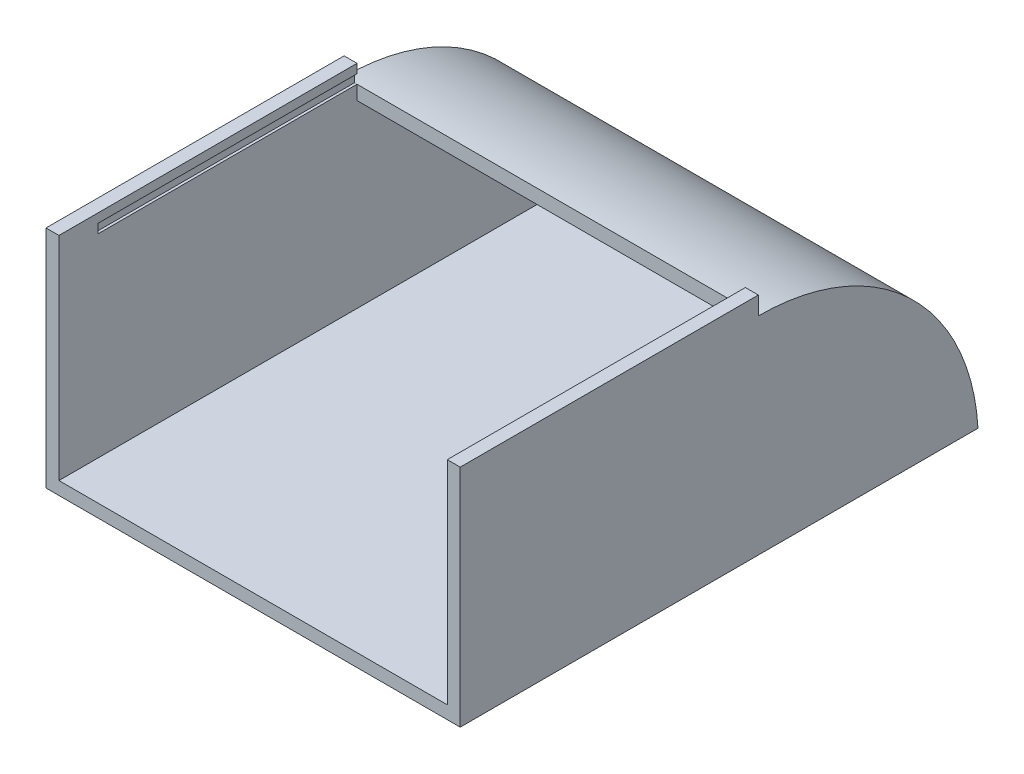
ISO-10303-21;
HEADER;
FILE_DESCRIPTION(('STEP AP214'),'2;1');
FILE_NAME('part.step','',(''),(''),'','','');
FILE_SCHEMA(('AUTOMOTIVE_DESIGN { 1 0 10303 214 1 1 1 1 }'));
ENDSEC;
DATA;
#1=APPLICATION_CONTEXT('core data for automotive mechanical design processes');
#2=APPLICATION_PROTOCOL_DEFINITION('international standard','automotive_design',2000,#1);
#3=PRODUCT_CONTEXT('',#1,'mechanical');
#4=PRODUCT('Part','Part','',(#3));
#5=PRODUCT_RELATED_PRODUCT_CATEGORY('part','',(#4));
#6=PRODUCT_DEFINITION_FORMATION('','',#4);
#7=PRODUCT_DEFINITION_CONTEXT('part definition',#1,'design');
#8=PRODUCT_DEFINITION('design','',#6,#7);
#9=PRODUCT_DEFINITION_SHAPE('','',#8);
#10=(LENGTH_UNIT() NAMED_UNIT(*) SI_UNIT(.MILLI.,.METRE.));
#11=(NAMED_UNIT(*) PLANE_ANGLE_UNIT() SI_UNIT($,.RADIAN.));
#12=(NAMED_UNIT(*) SI_UNIT($,.STERADIAN.) SOLID_ANGLE_UNIT());
#13=UNCERTAINTY_MEASURE_WITH_UNIT(LENGTH_MEASURE(1.E-05),#10,'distance_accuracy_value','');
#14=(GEOMETRIC_REPRESENTATION_CONTEXT(3) GLOBAL_UNCERTAINTY_ASSIGNED_CONTEXT((#13)) GLOBAL_UNIT_ASSIGNED_CONTEXT((#10,
#11,#12)) REPRESENTATION_CONTEXT('',''));
#15=CARTESIAN_POINT('',(0.,0.,0.));
#16=DIRECTION('',(0.,0.,1.));
#17=DIRECTION('',(1.,0.,0.));
#18=AXIS2_PLACEMENT_3D('',#15,#16,#17);
#19=CARTESIAN_POINT('',(80.,-40.,100.));
#20=DIRECTION('',(0.,0.,-1.));
#21=DIRECTION('',(-1.,0.,0.));
#22=AXIS2_PLACEMENT_3D('',#19,#20,#21);
#23=PLANE('',#22);
#24=DIRECTION('',(0.,-1.,0.));
#25=VECTOR('',#24,1.);
#26=CARTESIAN_POINT('',(80.,-40.,100.));
#27=LINE('',#26,#25);
#28=CARTESIAN_POINT('',(80.,47.,100.));
#29=VERTEX_POINT('',#28);
#30=CARTESIAN_POINT('',(80.,-40.,100.));
#31=VERTEX_POINT('',#30);
#32=EDGE_CURVE('E221',#29,#31,#27,.T.);
#33=ORIENTED_EDGE('',*,*,#32,.F.);
#34=DIRECTION('',(1.,0.,0.));
#35=VECTOR('',#34,1.);
#36=CARTESIAN_POINT('',(75.,47.,100.));
#37=LINE('',#36,#35);
#38=CARTESIAN_POINT('',(75.,47.,100.));
#39=VERTEX_POINT('',#38);
#40=EDGE_CURVE('E276',#39,#29,#37,.T.);
#41=ORIENTED_EDGE('',*,*,#40,.F.);
#42=DIRECTION('',(0.,1.,0.));
#43=VECTOR('',#42,1.);
#44=CARTESIAN_POINT('',(75.,-35.,100.));
#45=LINE('',#44,#43);
#46=CARTESIAN_POINT('',(75.,-35.,100.));
#47=VERTEX_POINT('',#46);
#48=EDGE_CURVE('E234',#47,#39,#45,.T.);
#49=ORIENTED_EDGE('',*,*,#48,.F.);
#50=DIRECTION('',(1.,0.,0.));
#51=VECTOR('',#50,1.);
#52=CARTESIAN_POINT('',(75.,-35.,100.));
#53=LINE('',#52,#51);
#54=CARTESIAN_POINT('',(-75.,-35.,100.));
#55=VERTEX_POINT('',#54);
#56=EDGE_CURVE('E236',#55,#47,#53,.T.);
#57=ORIENTED_EDGE('',*,*,#56,.F.);
#58=DIRECTION('',(0.,-1.,0.));
#59=VECTOR('',#58,1.);
#60=CARTESIAN_POINT('',(-75.,-35.,100.));
#61=LINE('',#60,#59);
#62=CARTESIAN_POINT('',(-75.,47.,100.));
#63=VERTEX_POINT('',#62);
#64=EDGE_CURVE('E239',#63,#55,#61,.T.);
#65=ORIENTED_EDGE('',*,*,#64,.F.);
#66=DIRECTION('',(1.,0.,0.));
#67=VECTOR('',#66,1.);
#68=CARTESIAN_POINT('',(-80.,47.,100.));
#69=LINE('',#68,#67);
#70=CARTESIAN_POINT('',(-80.,47.,100.));
#71=VERTEX_POINT('',#70);
#72=EDGE_CURVE('E262',#71,#63,#69,.T.);
#73=ORIENTED_EDGE('',*,*,#72,.F.);
#74=DIRECTION('',(0.,-1.,0.));
#75=VECTOR('',#74,1.);
#76=CARTESIAN_POINT('',(-80.,-40.,100.));
#77=LINE('',#76,#75);
#78=CARTESIAN_POINT('',(-80.,-40.,100.));
#79=VERTEX_POINT('',#78);
#80=EDGE_CURVE('E222',#71,#79,#77,.T.);
#81=ORIENTED_EDGE('',*,*,#80,.T.);
#82=DIRECTION('',(-1.,0.,0.));
#83=VECTOR('',#82,1.);
#84=CARTESIAN_POINT('',(80.,-40.,100.));
#85=LINE('',#84,#83);
#86=EDGE_CURVE('E209',#31,#79,#85,.T.);
#87=ORIENTED_EDGE('',*,*,#86,.F.);
#88=EDGE_LOOP('',(#33,#41,#49,#57,#65,#73,#81,#87));
#89=FACE_BOUND('',#88,.T.);
#90=ADVANCED_FACE('F33',(#89),#23,.F.);
#91=CARTESIAN_POINT('',(80.,-40.,-100.));
#92=DIRECTION('',(0.,1.,0.));
#93=DIRECTION('',(0.,0.,1.));
#94=AXIS2_PLACEMENT_3D('',#91,#92,#93);
#95=PLANE('',#94);
#96=DIRECTION('',(0.,0.,-1.));
#97=VECTOR('',#96,1.);
#98=CARTESIAN_POINT('',(-80.,-40.,-100.));
#99=LINE('',#98,#97);
#100=CARTESIAN_POINT('',(-80.,-40.,-100.));
#101=VERTEX_POINT('',#100);
#102=EDGE_CURVE('E218',#79,#101,#99,.T.);
#103=ORIENTED_EDGE('',*,*,#102,.T.);
#104=DIRECTION('',(-1.,0.,0.));
#105=VECTOR('',#104,1.);
#106=CARTESIAN_POINT('',(80.,-40.,-100.));
#107=LINE('',#106,#105);
#108=CARTESIAN_POINT('',(80.,-40.,-100.));
#109=VERTEX_POINT('',#108);
#110=EDGE_CURVE('E214',#109,#101,#107,.T.);
#111=ORIENTED_EDGE('',*,*,#110,.F.);
#112=DIRECTION('',(0.,0.,-1.));
#113=VECTOR('',#112,1.);
#114=CARTESIAN_POINT('',(80.,-40.,-100.));
#115=LINE('',#114,#113);
#116=EDGE_CURVE('E217',#31,#109,#115,.T.);
#117=ORIENTED_EDGE('',*,*,#116,.F.);
#118=ORIENTED_EDGE('',*,*,#86,.T.);
#119=EDGE_LOOP('',(#103,#111,#117,#118));
#120=FACE_BOUND('',#119,.T.);
#121=ADVANCED_FACE('F333',(#120),#95,.F.);
#122=CARTESIAN_POINT('',(80.,0.,0.));
#123=DIRECTION('',(1.,0.,0.));
#124=DIRECTION('',(0.,0.,-1.));
#125=AXIS2_PLACEMENT_3D('',#122,#123,#124);
#126=PLANE('',#125);
#127=ORIENTED_EDGE('',*,*,#116,.T.);
#128=CARTESIAN_POINT('',(80.,-45.,-15.1471862576143));
#129=DIRECTION('',(1.,0.,0.));
#130=DIRECTION('',(0.,0.,-1.));
#131=AXIS2_PLACEMENT_3D('',#128,#129,#130);
#132=CIRCLE('',#131,85.);
#133=CARTESIAN_POINT('',(80.,40.,-15.1471862576143));
#134=VERTEX_POINT('',#133);
#135=EDGE_CURVE('E11',#109,#134,#132,.T.);
#136=ORIENTED_EDGE('',*,*,#135,.T.);
#137=DIRECTION('',(0.,-1.,0.));
#138=VECTOR('',#137,1.);
#139=CARTESIAN_POINT('',(80.,47.,-15.1471862576143));
#140=LINE('',#139,#138);
#141=CARTESIAN_POINT('',(80.,47.,-15.1471862576143));
#142=VERTEX_POINT('',#141);
#143=EDGE_CURVE('E192',#142,#134,#140,.T.);
#144=ORIENTED_EDGE('',*,*,#143,.F.);
#145=DIRECTION('',(0.,0.,-1.));
#146=VECTOR('',#145,1.);
#147=CARTESIAN_POINT('',(80.,47.,-15.1471862576143));
#148=LINE('',#147,#146);
#149=EDGE_CURVE('E274',#29,#142,#148,.T.);
#150=ORIENTED_EDGE('',*,*,#149,.F.);
#151=ORIENTED_EDGE('',*,*,#32,.T.);
#152=EDGE_LOOP('',(#127,#136,#144,#150,#151));
#153=FACE_BOUND('',#152,.T.);
#154=ADVANCED_FACE('F330',(#153),#126,.T.);
#155=CARTESIAN_POINT('',(-80.,0.,0.));
#156=DIRECTION('',(1.,0.,0.));
#157=DIRECTION('',(0.,0.,-1.));
#158=AXIS2_PLACEMENT_3D('',#155,#156,#157);
#159=PLANE('',#158);
#160=ORIENTED_EDGE('',*,*,#80,.F.);
#161=DIRECTION('',(0.,0.,1.));
#162=VECTOR('',#161,1.);
#163=CARTESIAN_POINT('',(-80.,47.,-15.1471862576143));
#164=LINE('',#163,#162);
#165=CARTESIAN_POINT('',(-80.,47.,-15.1471862576143));
#166=VERTEX_POINT('',#165);
#167=EDGE_CURVE('E265',#166,#71,#164,.T.);
#168=ORIENTED_EDGE('',*,*,#167,.F.);
#169=DIRECTION('',(0.,-1.,0.));
#170=VECTOR('',#169,1.);
#171=CARTESIAN_POINT('',(-80.,47.,-15.1471862576143));
#172=LINE('',#171,#170);
#173=CARTESIAN_POINT('',(-80.,40.,-15.1471862576143));
#174=VERTEX_POINT('',#173);
#175=EDGE_CURVE('E255',#166,#174,#172,.T.);
#176=ORIENTED_EDGE('',*,*,#175,.T.);
#177=CARTESIAN_POINT('',(-80.,-45.,-15.1471862576143));
#178=DIRECTION('',(1.,0.,0.));
#179=DIRECTION('',(0.,0.,-1.));
#180=AXIS2_PLACEMENT_3D('',#177,#178,#179);
#181=CIRCLE('',#180,85.);
#182=EDGE_CURVE('E41',#174,#101,#181,.F.);
#183=ORIENTED_EDGE('',*,*,#182,.T.);
#184=ORIENTED_EDGE('',*,*,#102,.F.);
#185=EDGE_LOOP('',(#160,#168,#176,#183,#184));
#186=FACE_BOUND('',#185,.T.);
#187=ADVANCED_FACE('F336',(#186),#159,.F.);
#188=CARTESIAN_POINT('',(-75.,-35.,-90.));
#189=DIRECTION('',(-1.,0.,0.));
#190=DIRECTION('',(0.,0.,1.));
#191=AXIS2_PLACEMENT_3D('',#188,#189,#190);
#192=PLANE('',#191);
#193=DIRECTION('',(0.,1.,0.));
#194=VECTOR('',#193,1.);
#195=CARTESIAN_POINT('',(-75.,30.,-15.1471862576143));
#196=LINE('',#195,#194);
#197=CARTESIAN_POINT('',(-75.,34.5418695157532,-15.1471862576143));
#198=VERTEX_POINT('',#197);
#199=CARTESIAN_POINT('',(-75.,40.,-15.1471862576143));
#200=VERTEX_POINT('',#199);
#201=EDGE_CURVE('E247',#198,#200,#196,.T.);
#202=ORIENTED_EDGE('',*,*,#201,.T.);
#203=DIRECTION('',(0.,0.,-1.));
#204=VECTOR('',#203,1.);
#205=CARTESIAN_POINT('',(-75.,40.,-15.1471862576143));
#206=LINE('',#205,#204);
#207=CARTESIAN_POINT('',(-75.,40.,84.8528137423857));
#208=VERTEX_POINT('',#207);
#209=EDGE_CURVE('E288',#208,#200,#206,.T.);
#210=ORIENTED_EDGE('',*,*,#209,.F.);
#211=DIRECTION('',(0.,-1.,0.));
#212=VECTOR('',#211,1.);
#213=CARTESIAN_POINT('',(-75.,40.,84.8528137423857));
#214=LINE('',#213,#212);
#215=CARTESIAN_POINT('',(-75.,43.5,84.8528137423857));
#216=VERTEX_POINT('',#215);
#217=EDGE_CURVE('E291',#216,#208,#214,.T.);
#218=ORIENTED_EDGE('',*,*,#217,.F.);
#219=DIRECTION('',(0.,0.,1.));
#220=VECTOR('',#219,1.);
#221=CARTESIAN_POINT('',(-75.,43.5,-15.1471862576143));
#222=LINE('',#221,#220);
#223=CARTESIAN_POINT('',(-75.,43.5,-15.1471862576143));
#224=VERTEX_POINT('',#223);
#225=EDGE_CURVE('E294',#224,#216,#222,.T.);
#226=ORIENTED_EDGE('',*,*,#225,.F.);
#227=DIRECTION('',(0.,-1.,0.));
#228=VECTOR('',#227,1.);
#229=CARTESIAN_POINT('',(-75.,47.,-15.1471862576143));
#230=LINE('',#229,#228);
#231=CARTESIAN_POINT('',(-75.,47.,-15.1471862576143));
#232=VERTEX_POINT('',#231);
#233=EDGE_CURVE('E252',#232,#224,#230,.T.);
#234=ORIENTED_EDGE('',*,*,#233,.F.);
#235=DIRECTION('',(0.,0.,-1.));
#236=VECTOR('',#235,1.);
#237=CARTESIAN_POINT('',(-75.,47.,-15.1471862576143));
#238=LINE('',#237,#236);
#239=EDGE_CURVE('E260',#63,#232,#238,.T.);
#240=ORIENTED_EDGE('',*,*,#239,.F.);
#241=ORIENTED_EDGE('',*,*,#64,.T.);
#242=DIRECTION('',(0.,0.,1.));
#243=VECTOR('',#242,1.);
#244=CARTESIAN_POINT('',(-75.,-35.,-90.));
#245=LINE('',#244,#243);
#246=CARTESIAN_POINT('',(-75.,-35.,-90.));
#247=VERTEX_POINT('',#246);
#248=EDGE_CURVE('E229',#247,#55,#245,.T.);
#249=ORIENTED_EDGE('',*,*,#248,.F.);
#250=CARTESIAN_POINT('',(-75.,-50.,-6.33399734659242));
#251=DIRECTION('',(-1.,0.,0.));
#252=DIRECTION('',(0.,0.,1.));
#253=AXIS2_PLACEMENT_3D('',#250,#251,#252);
#254=CIRCLE('',#253,85.);
#255=EDGE_CURVE('E203',#247,#198,#254,.F.);
#256=ORIENTED_EDGE('',*,*,#255,.T.);
#257=EDGE_LOOP('',(#202,#210,#218,#226,#234,#240,#241,#249,#256));
#258=FACE_BOUND('',#257,.T.);
#259=ADVANCED_FACE('F348',(#258),#192,.F.);
#260=CARTESIAN_POINT('',(75.,-35.,-90.));
#261=DIRECTION('',(1.,0.,0.));
#262=DIRECTION('',(0.,0.,-1.));
#263=AXIS2_PLACEMENT_3D('',#260,#261,#262);
#264=PLANE('',#263);
#265=DIRECTION('',(0.,-1.,0.));
#266=VECTOR('',#265,1.);
#267=CARTESIAN_POINT('',(75.,47.,-15.1471862576143));
#268=LINE('',#267,#266);
#269=CARTESIAN_POINT('',(75.,47.,-15.1471862576143));
#270=VERTEX_POINT('',#269);
#271=CARTESIAN_POINT('',(75.,43.5,-15.1471862576143));
#272=VERTEX_POINT('',#271);
#273=EDGE_CURVE('E269',#270,#272,#268,.T.);
#274=ORIENTED_EDGE('',*,*,#273,.T.);
#275=DIRECTION('',(0.,0.,-1.));
#276=VECTOR('',#275,1.);
#277=CARTESIAN_POINT('',(75.,43.5,-15.1471862576143));
#278=LINE('',#277,#276);
#279=CARTESIAN_POINT('',(75.,43.5,84.8528137423857));
#280=VERTEX_POINT('',#279);
#281=EDGE_CURVE('E176',#280,#272,#278,.T.);
#282=ORIENTED_EDGE('',*,*,#281,.F.);
#283=DIRECTION('',(0.,1.,0.));
#284=VECTOR('',#283,1.);
#285=CARTESIAN_POINT('',(75.,40.,84.8528137423857));
#286=LINE('',#285,#284);
#287=CARTESIAN_POINT('',(75.,40.,84.8528137423857));
#288=VERTEX_POINT('',#287);
#289=EDGE_CURVE('E310',#288,#280,#286,.T.);
#290=ORIENTED_EDGE('',*,*,#289,.F.);
#291=DIRECTION('',(0.,0.,1.));
#292=VECTOR('',#291,1.);
#293=CARTESIAN_POINT('',(75.,40.,-15.1471862576143));
#294=LINE('',#293,#292);
#295=CARTESIAN_POINT('',(75.,40.,-15.1471862576143));
#296=VERTEX_POINT('',#295);
#297=EDGE_CURVE('E313',#296,#288,#294,.T.);
#298=ORIENTED_EDGE('',*,*,#297,.F.);
#299=DIRECTION('',(0.,1.,0.));
#300=VECTOR('',#299,1.);
#301=CARTESIAN_POINT('',(75.,30.,-15.1471862576143));
#302=LINE('',#301,#300);
#303=CARTESIAN_POINT('',(75.,34.5418695157532,-15.1471862576143));
#304=VERTEX_POINT('',#303);
#305=EDGE_CURVE('E246',#304,#296,#302,.T.);
#306=ORIENTED_EDGE('',*,*,#305,.F.);
#307=CARTESIAN_POINT('',(75.,-50.,-6.33399734659242));
#308=DIRECTION('',(1.,0.,0.));
#309=DIRECTION('',(0.,0.,-1.));
#310=AXIS2_PLACEMENT_3D('',#307,#308,#309);
#311=CIRCLE('',#310,85.);
#312=CARTESIAN_POINT('',(75.,-35.,-90.));
#313=VERTEX_POINT('',#312);
#314=EDGE_CURVE('E197',#304,#313,#311,.F.);
#315=ORIENTED_EDGE('',*,*,#314,.T.);
#316=DIRECTION('',(0.,0.,1.));
#317=VECTOR('',#316,1.);
#318=CARTESIAN_POINT('',(75.,-35.,-90.));
#319=LINE('',#318,#317);
#320=EDGE_CURVE('E225',#313,#47,#319,.T.);
#321=ORIENTED_EDGE('',*,*,#320,.T.);
#322=ORIENTED_EDGE('',*,*,#48,.T.);
#323=DIRECTION('',(0.,0.,1.));
#324=VECTOR('',#323,1.);
#325=CARTESIAN_POINT('',(75.,47.,-15.1471862576143));
#326=LINE('',#325,#324);
#327=EDGE_CURVE('E279',#270,#39,#326,.T.);
#328=ORIENTED_EDGE('',*,*,#327,.F.);
#329=EDGE_LOOP('',(#274,#282,#290,#298,#306,#315,#321,#322,#328));
#330=FACE_BOUND('',#329,.T.);
#331=ADVANCED_FACE('F322',(#330),#264,.F.);
#332=CARTESIAN_POINT('',(75.,-35.,-90.));
#333=DIRECTION('',(0.,-1.,0.));
#334=DIRECTION('',(1.,0.,0.));
#335=AXIS2_PLACEMENT_3D('',#332,#333,#334);
#336=PLANE('',#335);
#337=ORIENTED_EDGE('',*,*,#56,.T.);
#338=ORIENTED_EDGE('',*,*,#320,.F.);
#339=DIRECTION('',(1.,0.,0.));
#340=VECTOR('',#339,1.);
#341=CARTESIAN_POINT('',(75.,-35.,-90.));
#342=LINE('',#341,#340);
#343=EDGE_CURVE('E232',#247,#313,#342,.T.);
#344=ORIENTED_EDGE('',*,*,#343,.F.);
#345=ORIENTED_EDGE('',*,*,#248,.T.);
#346=EDGE_LOOP('',(#337,#338,#344,#345));
#347=FACE_BOUND('',#346,.T.);
#348=ADVANCED_FACE('F363',(#347),#336,.F.);
#349=CARTESIAN_POINT('',(0.,-50.,-6.33399734659242));
#350=DIRECTION('',(1.,0.,0.));
#351=DIRECTION('',(0.,1.,0.));
#352=AXIS2_PLACEMENT_3D('',#349,#350,#351);
#353=CYLINDRICAL_SURFACE('',#352,85.);
#354=ORIENTED_EDGE('',*,*,#314,.F.);
#355=DIRECTION('',(1.,0.,0.));
#356=VECTOR('',#355,1.);
#357=CARTESIAN_POINT('',(0.,34.5418695157532,-15.1471862576143));
#358=LINE('',#357,#356);
#359=EDGE_CURVE('E241',#304,#198,#358,.F.);
#360=ORIENTED_EDGE('',*,*,#359,.T.);
#361=ORIENTED_EDGE('',*,*,#255,.F.);
#362=ORIENTED_EDGE('',*,*,#343,.T.);
#363=EDGE_LOOP('',(#354,#360,#361,#362));
#364=FACE_BOUND('',#363,.T.);
#365=ADVANCED_FACE('F360',(#364),#353,.F.);
#366=CARTESIAN_POINT('',(80.,-45.,-15.1471862576143));
#367=DIRECTION('',(-1.,0.,0.));
#368=DIRECTION('',(0.,0.,1.));
#369=AXIS2_PLACEMENT_3D('',#366,#367,#368);
#370=CYLINDRICAL_SURFACE('',#369,85.);
#371=ORIENTED_EDGE('',*,*,#135,.F.);
#372=ORIENTED_EDGE('',*,*,#110,.T.);
#373=ORIENTED_EDGE('',*,*,#182,.F.);
#374=DIRECTION('',(-1.,0.,0.));
#375=VECTOR('',#374,1.);
#376=CARTESIAN_POINT('',(80.,40.,-15.1471862576143));
#377=LINE('',#376,#375);
#378=CARTESIAN_POINT('',(-76.,40.,-15.1471862576143));
#379=VERTEX_POINT('',#378);
#380=EDGE_CURVE('E195',#379,#174,#377,.T.);
#381=ORIENTED_EDGE('',*,*,#380,.F.);
#382=EDGE_CURVE('E193',#200,#379,#377,.T.);
#383=ORIENTED_EDGE('',*,*,#382,.F.);
#384=DIRECTION('',(-1.,0.,0.));
#385=VECTOR('',#384,1.);
#386=CARTESIAN_POINT('',(0.,40.,-15.1471862576143));
#387=LINE('',#386,#385);
#388=EDGE_CURVE('E186',#296,#200,#387,.T.);
#389=ORIENTED_EDGE('',*,*,#388,.F.);
#390=DIRECTION('',(-1.,0.,0.));
#391=VECTOR('',#390,1.);
#392=CARTESIAN_POINT('',(76.,40.,-15.1471862576143));
#393=LINE('',#392,#391);
#394=CARTESIAN_POINT('',(76.,40.,-15.1471862576143));
#395=VERTEX_POINT('',#394);
#396=EDGE_CURVE('E164',#395,#296,#393,.T.);
#397=ORIENTED_EDGE('',*,*,#396,.F.);
#398=EDGE_CURVE('E182',#134,#395,#377,.T.);
#399=ORIENTED_EDGE('',*,*,#398,.F.);
#400=EDGE_LOOP('',(#371,#372,#373,#381,#383,#389,#397,#399));
#401=FACE_BOUND('',#400,.T.);
#402=ADVANCED_FACE('F35',(#401),#370,.T.);
#403=CARTESIAN_POINT('',(0.,30.,-15.1471862576143));
#404=DIRECTION('',(0.,0.,-1.));
#405=DIRECTION('',(0.,1.,0.));
#406=AXIS2_PLACEMENT_3D('',#403,#404,#405);
#407=PLANE('',#406);
#408=ORIENTED_EDGE('',*,*,#305,.T.);
#409=ORIENTED_EDGE('',*,*,#388,.T.);
#410=ORIENTED_EDGE('',*,*,#201,.F.);
#411=ORIENTED_EDGE('',*,*,#359,.F.);
#412=EDGE_LOOP('',(#408,#409,#410,#411));
#413=FACE_BOUND('',#412,.T.);
#414=ADVANCED_FACE('F358',(#413),#407,.F.);
#415=CARTESIAN_POINT('',(-80.,47.,-15.1471862576143));
#416=DIRECTION('',(0.,0.,1.));
#417=DIRECTION('',(0.,-1.,0.));
#418=AXIS2_PLACEMENT_3D('',#415,#416,#417);
#419=PLANE('',#418);
#420=ORIENTED_EDGE('',*,*,#233,.T.);
#421=DIRECTION('',(1.,0.,0.));
#422=VECTOR('',#421,1.);
#423=CARTESIAN_POINT('',(-76.,43.5,-15.1471862576143));
#424=LINE('',#423,#422);
#425=CARTESIAN_POINT('',(-76.,43.5,-15.1471862576143));
#426=VERTEX_POINT('',#425);
#427=EDGE_CURVE('E283',#426,#224,#424,.T.);
#428=ORIENTED_EDGE('',*,*,#427,.F.);
#429=DIRECTION('',(0.,1.,0.));
#430=VECTOR('',#429,1.);
#431=CARTESIAN_POINT('',(-76.,40.,-15.1471862576143));
#432=LINE('',#431,#430);
#433=EDGE_CURVE('E290',#379,#426,#432,.T.);
#434=ORIENTED_EDGE('',*,*,#433,.F.);
#435=ORIENTED_EDGE('',*,*,#380,.T.);
#436=ORIENTED_EDGE('',*,*,#175,.F.);
#437=DIRECTION('',(-1.,0.,0.));
#438=VECTOR('',#437,1.);
#439=CARTESIAN_POINT('',(-80.,47.,-15.1471862576143));
#440=LINE('',#439,#438);
#441=EDGE_CURVE('E258',#232,#166,#440,.T.);
#442=ORIENTED_EDGE('',*,*,#441,.F.);
#443=EDGE_LOOP('',(#420,#428,#434,#435,#436,#442));
#444=FACE_BOUND('',#443,.T.);
#445=ADVANCED_FACE('F340',(#444),#419,.F.);
#446=CARTESIAN_POINT('',(0.,47.,0.));
#447=DIRECTION('',(0.,1.,0.));
#448=DIRECTION('',(0.,0.,1.));
#449=AXIS2_PLACEMENT_3D('',#446,#447,#448);
#450=PLANE('',#449);
#451=ORIENTED_EDGE('',*,*,#167,.T.);
#452=ORIENTED_EDGE('',*,*,#72,.T.);
#453=ORIENTED_EDGE('',*,*,#239,.T.);
#454=ORIENTED_EDGE('',*,*,#441,.T.);
#455=EDGE_LOOP('',(#451,#452,#453,#454));
#456=FACE_BOUND('',#455,.T.);
#457=ADVANCED_FACE('F344',(#456),#450,.T.);
#458=CARTESIAN_POINT('',(75.,47.,-15.1471862576143));
#459=DIRECTION('',(0.,0.,1.));
#460=DIRECTION('',(0.,-1.,0.));
#461=AXIS2_PLACEMENT_3D('',#458,#459,#460);
#462=PLANE('',#461);
#463=DIRECTION('',(0.,-1.,0.));
#464=VECTOR('',#463,1.);
#465=CARTESIAN_POINT('',(76.,40.,-15.1471862576143));
#466=LINE('',#465,#464);
#467=CARTESIAN_POINT('',(76.,43.5,-15.1471862576143));
#468=VERTEX_POINT('',#467);
#469=EDGE_CURVE('E169',#468,#395,#466,.T.);
#470=ORIENTED_EDGE('',*,*,#469,.F.);
#471=DIRECTION('',(-1.,0.,0.));
#472=VECTOR('',#471,1.);
#473=CARTESIAN_POINT('',(76.,43.5,-15.1471862576143));
#474=LINE('',#473,#472);
#475=EDGE_CURVE('E297',#468,#272,#474,.T.);
#476=ORIENTED_EDGE('',*,*,#475,.T.);
#477=ORIENTED_EDGE('',*,*,#273,.F.);
#478=DIRECTION('',(-1.,0.,0.));
#479=VECTOR('',#478,1.);
#480=CARTESIAN_POINT('',(75.,47.,-15.1471862576143));
#481=LINE('',#480,#479);
#482=EDGE_CURVE('E272',#142,#270,#481,.T.);
#483=ORIENTED_EDGE('',*,*,#482,.F.);
#484=ORIENTED_EDGE('',*,*,#143,.T.);
#485=ORIENTED_EDGE('',*,*,#398,.T.);
#486=EDGE_LOOP('',(#470,#476,#477,#483,#484,#485));
#487=FACE_BOUND('',#486,.T.);
#488=ADVANCED_FACE('F189',(#487),#462,.F.);
#489=CARTESIAN_POINT('',(0.,47.,0.));
#490=DIRECTION('',(0.,1.,0.));
#491=DIRECTION('',(0.,0.,1.));
#492=AXIS2_PLACEMENT_3D('',#489,#490,#491);
#493=PLANE('',#492);
#494=ORIENTED_EDGE('',*,*,#327,.T.);
#495=ORIENTED_EDGE('',*,*,#40,.T.);
#496=ORIENTED_EDGE('',*,*,#149,.T.);
#497=ORIENTED_EDGE('',*,*,#482,.T.);
#498=EDGE_LOOP('',(#494,#495,#496,#497));
#499=FACE_BOUND('',#498,.T.);
#500=ADVANCED_FACE('F327',(#499),#493,.T.);
#501=CARTESIAN_POINT('',(-76.,40.,-15.1471862576143));
#502=DIRECTION('',(0.,-1.,0.));
#503=DIRECTION('',(0.,0.,-1.));
#504=AXIS2_PLACEMENT_3D('',#501,#502,#503);
#505=PLANE('',#504);
#506=ORIENTED_EDGE('',*,*,#209,.T.);
#507=ORIENTED_EDGE('',*,*,#382,.T.);
#508=DIRECTION('',(0.,0.,-1.));
#509=VECTOR('',#508,1.);
#510=CARTESIAN_POINT('',(-76.,40.,-15.1471862576143));
#511=LINE('',#510,#509);
#512=CARTESIAN_POINT('',(-76.,40.,84.8528137423857));
#513=VERTEX_POINT('',#512);
#514=EDGE_CURVE('E56',#513,#379,#511,.T.);
#515=ORIENTED_EDGE('',*,*,#514,.F.);
#516=DIRECTION('',(1.,0.,0.));
#517=VECTOR('',#516,1.);
#518=CARTESIAN_POINT('',(-76.,40.,84.8528137423857));
#519=LINE('',#518,#517);
#520=EDGE_CURVE('E282',#513,#208,#519,.T.);
#521=ORIENTED_EDGE('',*,*,#520,.T.);
#522=EDGE_LOOP('',(#506,#507,#515,#521));
#523=FACE_BOUND('',#522,.T.);
#524=ADVANCED_FACE('F355',(#523),#505,.F.);
#525=CARTESIAN_POINT('',(-76.,40.,84.8528137423857));
#526=DIRECTION('',(0.,0.,1.));
#527=DIRECTION('',(1.,0.,0.));
#528=AXIS2_PLACEMENT_3D('',#525,#526,#527);
#529=PLANE('',#528);
#530=ORIENTED_EDGE('',*,*,#217,.T.);
#531=ORIENTED_EDGE('',*,*,#520,.F.);
#532=DIRECTION('',(0.,-1.,0.));
#533=VECTOR('',#532,1.);
#534=CARTESIAN_POINT('',(-76.,40.,84.8528137423857));
#535=LINE('',#534,#533);
#536=CARTESIAN_POINT('',(-76.,43.5,84.8528137423857));
#537=VERTEX_POINT('',#536);
#538=EDGE_CURVE('E299',#537,#513,#535,.T.);
#539=ORIENTED_EDGE('',*,*,#538,.F.);
#540=DIRECTION('',(1.,0.,0.));
#541=VECTOR('',#540,1.);
#542=CARTESIAN_POINT('',(-76.,43.5,84.8528137423857));
#543=LINE('',#542,#541);
#544=EDGE_CURVE('E285',#537,#216,#543,.T.);
#545=ORIENTED_EDGE('',*,*,#544,.T.);
#546=EDGE_LOOP('',(#530,#531,#539,#545));
#547=FACE_BOUND('',#546,.T.);
#548=ADVANCED_FACE('F436',(#547),#529,.F.);
#549=CARTESIAN_POINT('',(-76.,43.5,-15.1471862576143));
#550=DIRECTION('',(0.,1.,0.));
#551=DIRECTION('',(0.,0.,1.));
#552=AXIS2_PLACEMENT_3D('',#549,#550,#551);
#553=PLANE('',#552);
#554=ORIENTED_EDGE('',*,*,#225,.T.);
#555=ORIENTED_EDGE('',*,*,#544,.F.);
#556=DIRECTION('',(0.,0.,1.));
#557=VECTOR('',#556,1.);
#558=CARTESIAN_POINT('',(-76.,43.5,-15.1471862576143));
#559=LINE('',#558,#557);
#560=EDGE_CURVE('E301',#426,#537,#559,.T.);
#561=ORIENTED_EDGE('',*,*,#560,.F.);
#562=ORIENTED_EDGE('',*,*,#427,.T.);
#563=EDGE_LOOP('',(#554,#555,#561,#562));
#564=FACE_BOUND('',#563,.T.);
#565=ADVANCED_FACE('F352',(#564),#553,.F.);
#566=CARTESIAN_POINT('',(-76.,0.,0.));
#567=DIRECTION('',(1.,0.,0.));
#568=DIRECTION('',(0.,0.,-1.));
#569=AXIS2_PLACEMENT_3D('',#566,#567,#568);
#570=PLANE('',#569);
#571=ORIENTED_EDGE('',*,*,#433,.T.);
#572=ORIENTED_EDGE('',*,*,#560,.T.);
#573=ORIENTED_EDGE('',*,*,#538,.T.);
#574=ORIENTED_EDGE('',*,*,#514,.T.);
#575=EDGE_LOOP('',(#571,#572,#573,#574));
#576=FACE_BOUND('',#575,.T.);
#577=ADVANCED_FACE('F450',(#576),#570,.T.);
#578=CARTESIAN_POINT('',(76.,43.5,-15.1471862576143));
#579=DIRECTION('',(0.,1.,0.));
#580=DIRECTION('',(0.,0.,1.));
#581=AXIS2_PLACEMENT_3D('',#578,#579,#580);
#582=PLANE('',#581);
#583=ORIENTED_EDGE('',*,*,#281,.T.);
#584=ORIENTED_EDGE('',*,*,#475,.F.);
#585=DIRECTION('',(0.,0.,-1.));
#586=VECTOR('',#585,1.);
#587=CARTESIAN_POINT('',(76.,43.5,-15.1471862576143));
#588=LINE('',#587,#586);
#589=CARTESIAN_POINT('',(76.,43.5,84.8528137423857));
#590=VERTEX_POINT('',#589);
#591=EDGE_CURVE('E48',#590,#468,#588,.T.);
#592=ORIENTED_EDGE('',*,*,#591,.F.);
#593=DIRECTION('',(-1.,0.,0.));
#594=VECTOR('',#593,1.);
#595=CARTESIAN_POINT('',(76.,43.5,84.8528137423857));
#596=LINE('',#595,#594);
#597=EDGE_CURVE('E306',#590,#280,#596,.T.);
#598=ORIENTED_EDGE('',*,*,#597,.T.);
#599=EDGE_LOOP('',(#583,#584,#592,#598));
#600=FACE_BOUND('',#599,.T.);
#601=ADVANCED_FACE('F318',(#600),#582,.F.);
#602=CARTESIAN_POINT('',(76.,40.,84.8528137423857));
#603=DIRECTION('',(0.,0.,1.));
#604=DIRECTION('',(1.,0.,0.));
#605=AXIS2_PLACEMENT_3D('',#602,#603,#604);
#606=PLANE('',#605);
#607=ORIENTED_EDGE('',*,*,#289,.T.);
#608=ORIENTED_EDGE('',*,*,#597,.F.);
#609=DIRECTION('',(0.,1.,0.));
#610=VECTOR('',#609,1.);
#611=CARTESIAN_POINT('',(76.,40.,84.8528137423857));
#612=LINE('',#611,#610);
#613=CARTESIAN_POINT('',(76.,40.,84.8528137423857));
#614=VERTEX_POINT('',#613);
#615=EDGE_CURVE('E168',#614,#590,#612,.T.);
#616=ORIENTED_EDGE('',*,*,#615,.F.);
#617=DIRECTION('',(-1.,0.,0.));
#618=VECTOR('',#617,1.);
#619=CARTESIAN_POINT('',(76.,40.,84.8528137423857));
#620=LINE('',#619,#618);
#621=EDGE_CURVE('E166',#614,#288,#620,.T.);
#622=ORIENTED_EDGE('',*,*,#621,.T.);
#623=EDGE_LOOP('',(#607,#608,#616,#622));
#624=FACE_BOUND('',#623,.T.);
#625=ADVANCED_FACE('F461',(#624),#606,.F.);
#626=CARTESIAN_POINT('',(76.,40.,-15.1471862576143));
#627=DIRECTION('',(0.,-1.,0.));
#628=DIRECTION('',(0.,0.,-1.));
#629=AXIS2_PLACEMENT_3D('',#626,#627,#628);
#630=PLANE('',#629);
#631=ORIENTED_EDGE('',*,*,#297,.T.);
#632=ORIENTED_EDGE('',*,*,#621,.F.);
#633=DIRECTION('',(0.,0.,1.));
#634=VECTOR('',#633,1.);
#635=CARTESIAN_POINT('',(76.,40.,-15.1471862576143));
#636=LINE('',#635,#634);
#637=EDGE_CURVE('E160',#395,#614,#636,.T.);
#638=ORIENTED_EDGE('',*,*,#637,.F.);
#639=ORIENTED_EDGE('',*,*,#396,.T.);
#640=EDGE_LOOP('',(#631,#632,#638,#639));
#641=FACE_BOUND('',#640,.T.);
#642=ADVANCED_FACE('F162',(#641),#630,.F.);
#643=CARTESIAN_POINT('',(76.,0.,0.));
#644=DIRECTION('',(1.,0.,0.));
#645=DIRECTION('',(0.,0.,-1.));
#646=AXIS2_PLACEMENT_3D('',#643,#644,#645);
#647=PLANE('',#646);
#648=ORIENTED_EDGE('',*,*,#469,.T.);
#649=ORIENTED_EDGE('',*,*,#637,.T.);
#650=ORIENTED_EDGE('',*,*,#615,.T.);
#651=ORIENTED_EDGE('',*,*,#591,.T.);
#652=EDGE_LOOP('',(#648,#649,#650,#651));
#653=FACE_BOUND('',#652,.T.);
#654=ADVANCED_FACE('F172',(#653),#647,.F.);
#655=CLOSED_SHELL('',(#90,#121,#154,#187,#259,#331,#348,#365,#402,#414,#445,#457,#488,#500,#524,
#548,#565,#577,#601,#625,#642,#654));
#656=MANIFOLD_SOLID_BREP('B2',#655);
#657=ADVANCED_BREP_SHAPE_REPRESENTATION('',(#18,#656),#14);
#658=SHAPE_DEFINITION_REPRESENTATION(#9,#657);
ENDSEC;
END-ISO-10303-21;
